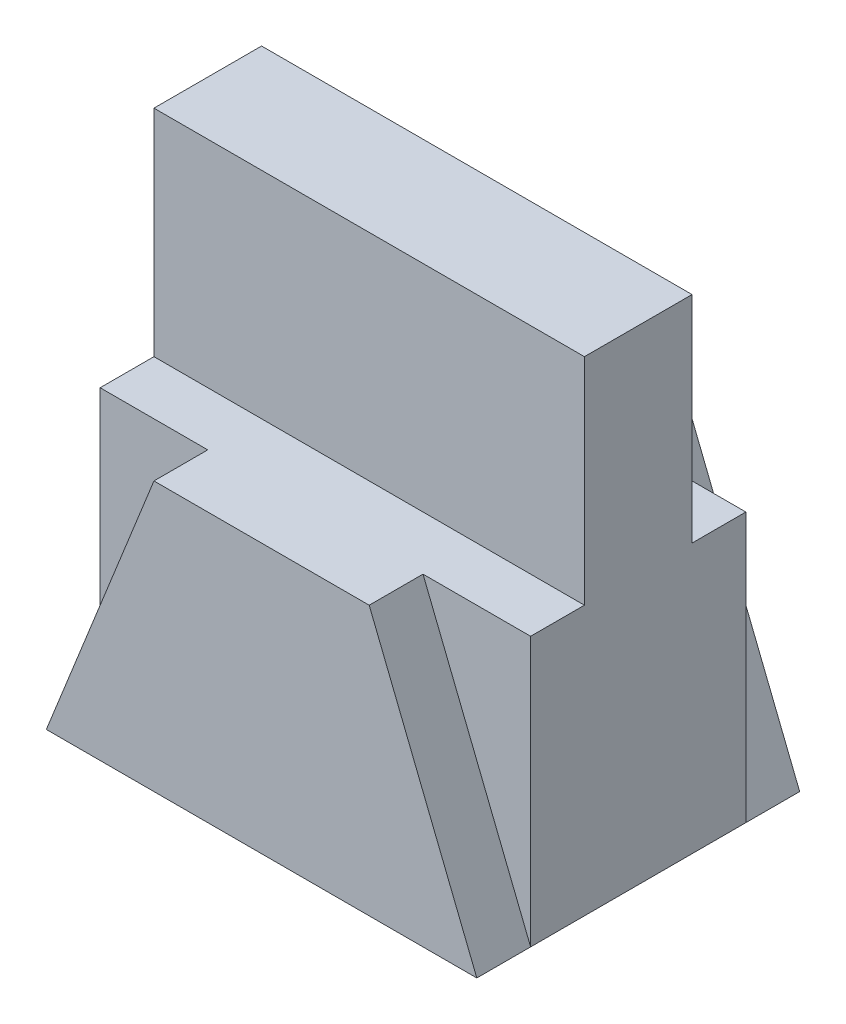
ISO-10303-21;
HEADER;
FILE_DESCRIPTION(('STEP AP214'),'2;1');
FILE_NAME('part.step','',(''),(''),'','','');
FILE_SCHEMA(('AUTOMOTIVE_DESIGN { 1 0 10303 214 1 1 1 1 }'));
ENDSEC;
DATA;
#1=APPLICATION_CONTEXT('core data for automotive mechanical design processes');
#2=APPLICATION_PROTOCOL_DEFINITION('international standard','automotive_design',2000,#1);
#3=PRODUCT_CONTEXT('',#1,'mechanical');
#4=PRODUCT('Part','Part','',(#3));
#5=PRODUCT_RELATED_PRODUCT_CATEGORY('part','',(#4));
#6=PRODUCT_DEFINITION_FORMATION('','',#4);
#7=PRODUCT_DEFINITION_CONTEXT('part definition',#1,'design');
#8=PRODUCT_DEFINITION('design','',#6,#7);
#9=PRODUCT_DEFINITION_SHAPE('','',#8);
#10=(LENGTH_UNIT() NAMED_UNIT(*) SI_UNIT(.MILLI.,.METRE.));
#11=(NAMED_UNIT(*) PLANE_ANGLE_UNIT() SI_UNIT($,.RADIAN.));
#12=(NAMED_UNIT(*) SI_UNIT($,.STERADIAN.) SOLID_ANGLE_UNIT());
#13=UNCERTAINTY_MEASURE_WITH_UNIT(LENGTH_MEASURE(1.E-05),#10,'distance_accuracy_value','');
#14=(GEOMETRIC_REPRESENTATION_CONTEXT(3) GLOBAL_UNCERTAINTY_ASSIGNED_CONTEXT((#13)) GLOBAL_UNIT_ASSIGNED_CONTEXT((#10,
#11,#12)) REPRESENTATION_CONTEXT('',''));
#15=CARTESIAN_POINT('',(0.,0.,0.));
#16=DIRECTION('',(0.,0.,1.));
#17=DIRECTION('',(1.,0.,0.));
#18=AXIS2_PLACEMENT_3D('',#15,#16,#17);
#19=CARTESIAN_POINT('',(20.,0.,-15.));
#20=DIRECTION('',(0.,0.,1.));
#21=DIRECTION('',(0.,-1.,0.));
#22=AXIS2_PLACEMENT_3D('',#19,#20,#21);
#23=PLANE('',#22);
#24=DIRECTION('',(0.371390676354103,-0.928476690885259,0.));
#25=VECTOR('',#24,1.);
#26=CARTESIAN_POINT('',(20.,0.,-15.));
#27=LINE('',#26,#25);
#28=CARTESIAN_POINT('',(10.,25.,-15.));
#29=VERTEX_POINT('',#28);
#30=CARTESIAN_POINT('',(20.,0.,-15.));
#31=VERTEX_POINT('',#30);
#32=EDGE_CURVE('E139',#29,#31,#27,.T.);
#33=ORIENTED_EDGE('',*,*,#32,.T.);
#34=DIRECTION('',(-1.,0.,0.));
#35=VECTOR('',#34,1.);
#36=CARTESIAN_POINT('',(20.,0.,-15.));
#37=LINE('',#36,#35);
#38=CARTESIAN_POINT('',(-20.,0.,-15.));
#39=VERTEX_POINT('',#38);
#40=EDGE_CURVE('E40',#31,#39,#37,.T.);
#41=ORIENTED_EDGE('',*,*,#40,.T.);
#42=DIRECTION('',(0.371390676354104,0.928476690885259,0.));
#43=VECTOR('',#42,1.);
#44=CARTESIAN_POINT('',(-10.,25.,-15.));
#45=LINE('',#44,#43);
#46=CARTESIAN_POINT('',(-10.,25.,-15.));
#47=VERTEX_POINT('',#46);
#48=EDGE_CURVE('E155',#39,#47,#45,.T.);
#49=ORIENTED_EDGE('',*,*,#48,.T.);
#50=DIRECTION('',(-1.,0.,0.));
#51=VECTOR('',#50,1.);
#52=CARTESIAN_POINT('',(20.,25.,-15.));
#53=LINE('',#52,#51);
#54=EDGE_CURVE('E239',#29,#47,#53,.T.);
#55=ORIENTED_EDGE('',*,*,#54,.F.);
#56=EDGE_LOOP('',(#33,#41,#49,#55));
#57=FACE_BOUND('',#56,.T.);
#58=ADVANCED_FACE('F32',(#57),#23,.F.);
#59=CARTESIAN_POINT('',(20.,25.,-15.));
#60=DIRECTION('',(0.,-1.,0.));
#61=DIRECTION('',(0.,0.,-1.));
#62=AXIS2_PLACEMENT_3D('',#59,#60,#61);
#63=PLANE('',#62);
#64=DIRECTION('',(0.,0.,-1.));
#65=VECTOR('',#64,1.);
#66=CARTESIAN_POINT('',(10.,25.,-10.));
#67=LINE('',#66,#65);
#68=CARTESIAN_POINT('',(10.,25.,-10.));
#69=VERTEX_POINT('',#68);
#70=EDGE_CURVE('E134',#69,#29,#67,.T.);
#71=ORIENTED_EDGE('',*,*,#70,.T.);
#72=ORIENTED_EDGE('',*,*,#54,.T.);
#73=DIRECTION('',(0.,0.,-1.));
#74=VECTOR('',#73,1.);
#75=CARTESIAN_POINT('',(-10.,25.,-10.));
#76=LINE('',#75,#74);
#77=CARTESIAN_POINT('',(-10.,25.,-10.));
#78=VERTEX_POINT('',#77);
#79=EDGE_CURVE('E165',#78,#47,#76,.T.);
#80=ORIENTED_EDGE('',*,*,#79,.F.);
#81=DIRECTION('',(-1.,0.,0.));
#82=VECTOR('',#81,1.);
#83=CARTESIAN_POINT('',(-20.,25.,-10.));
#84=LINE('',#83,#82);
#85=CARTESIAN_POINT('',(-20.,25.,-10.));
#86=VERTEX_POINT('',#85);
#87=EDGE_CURVE('E160',#78,#86,#84,.T.);
#88=ORIENTED_EDGE('',*,*,#87,.T.);
#89=DIRECTION('',(0.,0.,1.));
#90=VECTOR('',#89,1.);
#91=CARTESIAN_POINT('',(-20.,25.,-15.));
#92=LINE('',#91,#90);
#93=CARTESIAN_POINT('',(-20.,25.,-5.));
#94=VERTEX_POINT('',#93);
#95=EDGE_CURVE('E215',#86,#94,#92,.T.);
#96=ORIENTED_EDGE('',*,*,#95,.T.);
#97=DIRECTION('',(-1.,0.,0.));
#98=VECTOR('',#97,1.);
#99=CARTESIAN_POINT('',(20.,25.,-5.));
#100=LINE('',#99,#98);
#101=CARTESIAN_POINT('',(20.,25.,-5.));
#102=VERTEX_POINT('',#101);
#103=EDGE_CURVE('E236',#102,#94,#100,.T.);
#104=ORIENTED_EDGE('',*,*,#103,.F.);
#105=DIRECTION('',(0.,0.,1.));
#106=VECTOR('',#105,1.);
#107=CARTESIAN_POINT('',(20.,25.,-15.));
#108=LINE('',#107,#106);
#109=CARTESIAN_POINT('',(20.,25.,-9.99999999999999));
#110=VERTEX_POINT('',#109);
#111=EDGE_CURVE('E150',#110,#102,#108,.T.);
#112=ORIENTED_EDGE('',*,*,#111,.F.);
#113=DIRECTION('',(-1.,0.,0.));
#114=VECTOR('',#113,1.);
#115=CARTESIAN_POINT('',(10.,25.,-10.));
#116=LINE('',#115,#114);
#117=EDGE_CURVE('E47',#110,#69,#116,.T.);
#118=ORIENTED_EDGE('',*,*,#117,.T.);
#119=EDGE_LOOP('',(#71,#72,#80,#88,#96,#104,#112,#118));
#120=FACE_BOUND('',#119,.T.);
#121=ADVANCED_FACE('F148',(#120),#63,.F.);
#122=CARTESIAN_POINT('',(20.,25.,15.));
#123=DIRECTION('',(0.,0.,-1.));
#124=DIRECTION('',(0.,1.,0.));
#125=AXIS2_PLACEMENT_3D('',#122,#123,#124);
#126=PLANE('',#125);
#127=DIRECTION('',(-1.,0.,0.));
#128=VECTOR('',#127,1.);
#129=CARTESIAN_POINT('',(20.,0.,15.));
#130=LINE('',#129,#128);
#131=CARTESIAN_POINT('',(20.,0.,15.));
#132=VERTEX_POINT('',#131);
#133=CARTESIAN_POINT('',(-20.,0.,15.));
#134=VERTEX_POINT('',#133);
#135=EDGE_CURVE('E11',#132,#134,#130,.T.);
#136=ORIENTED_EDGE('',*,*,#135,.F.);
#137=DIRECTION('',(0.371390676354103,-0.928476690885259,0.));
#138=VECTOR('',#137,1.);
#139=CARTESIAN_POINT('',(20.,0.,15.));
#140=LINE('',#139,#138);
#141=CARTESIAN_POINT('',(10.,25.,15.));
#142=VERTEX_POINT('',#141);
#143=EDGE_CURVE('E169',#142,#132,#140,.T.);
#144=ORIENTED_EDGE('',*,*,#143,.F.);
#145=DIRECTION('',(-1.,0.,0.));
#146=VECTOR('',#145,1.);
#147=CARTESIAN_POINT('',(20.,25.,15.));
#148=LINE('',#147,#146);
#149=CARTESIAN_POINT('',(-10.,25.,15.));
#150=VERTEX_POINT('',#149);
#151=EDGE_CURVE('E211',#142,#150,#148,.T.);
#152=ORIENTED_EDGE('',*,*,#151,.T.);
#153=DIRECTION('',(0.371390676354104,0.928476690885259,0.));
#154=VECTOR('',#153,1.);
#155=CARTESIAN_POINT('',(-10.,25.,15.));
#156=LINE('',#155,#154);
#157=EDGE_CURVE('E182',#134,#150,#156,.T.);
#158=ORIENTED_EDGE('',*,*,#157,.F.);
#159=EDGE_LOOP('',(#136,#144,#152,#158));
#160=FACE_BOUND('',#159,.T.);
#161=ADVANCED_FACE('F34',(#160),#126,.F.);
#162=CARTESIAN_POINT('',(20.,0.,15.));
#163=DIRECTION('',(0.,1.,0.));
#164=DIRECTION('',(0.,0.,1.));
#165=AXIS2_PLACEMENT_3D('',#162,#163,#164);
#166=PLANE('',#165);
#167=DIRECTION('',(0.,0.,-1.));
#168=VECTOR('',#167,1.);
#169=CARTESIAN_POINT('',(-20.,0.,15.));
#170=LINE('',#169,#168);
#171=CARTESIAN_POINT('',(-20.,0.,10.));
#172=VERTEX_POINT('',#171);
#173=EDGE_CURVE('E212',#134,#172,#170,.T.);
#174=ORIENTED_EDGE('',*,*,#173,.T.);
#175=CARTESIAN_POINT('',(-20.,0.,-10.));
#176=VERTEX_POINT('',#175);
#177=EDGE_CURVE('E196',#172,#176,#170,.T.);
#178=ORIENTED_EDGE('',*,*,#177,.T.);
#179=DIRECTION('',(0.,0.,-1.));
#180=VECTOR('',#179,1.);
#181=CARTESIAN_POINT('',(-20.,0.,-10.));
#182=LINE('',#181,#180);
#183=EDGE_CURVE('E55',#176,#39,#182,.T.);
#184=ORIENTED_EDGE('',*,*,#183,.T.);
#185=ORIENTED_EDGE('',*,*,#40,.F.);
#186=DIRECTION('',(0.,0.,-1.));
#187=VECTOR('',#186,1.);
#188=CARTESIAN_POINT('',(20.,0.,-10.));
#189=LINE('',#188,#187);
#190=CARTESIAN_POINT('',(20.,0.,-10.));
#191=VERTEX_POINT('',#190);
#192=EDGE_CURVE('E142',#191,#31,#189,.T.);
#193=ORIENTED_EDGE('',*,*,#192,.F.);
#194=DIRECTION('',(0.,0.,-1.));
#195=VECTOR('',#194,1.);
#196=CARTESIAN_POINT('',(20.,0.,15.));
#197=LINE('',#196,#195);
#198=CARTESIAN_POINT('',(20.,0.,9.99999999999999));
#199=VERTEX_POINT('',#198);
#200=EDGE_CURVE('E200',#199,#191,#197,.T.);
#201=ORIENTED_EDGE('',*,*,#200,.F.);
#202=EDGE_CURVE('E197',#132,#199,#197,.T.);
#203=ORIENTED_EDGE('',*,*,#202,.F.);
#204=ORIENTED_EDGE('',*,*,#135,.T.);
#205=EDGE_LOOP('',(#174,#178,#184,#185,#193,#201,#203,#204));
#206=FACE_BOUND('',#205,.T.);
#207=ADVANCED_FACE('F244',(#206),#166,.F.);
#208=CARTESIAN_POINT('',(20.,25.,-5.));
#209=DIRECTION('',(0.,0.,1.));
#210=DIRECTION('',(0.,-1.,0.));
#211=AXIS2_PLACEMENT_3D('',#208,#209,#210);
#212=PLANE('',#211);
#213=DIRECTION('',(0.,1.,0.));
#214=VECTOR('',#213,1.);
#215=CARTESIAN_POINT('',(-20.,25.,-5.));
#216=LINE('',#215,#214);
#217=CARTESIAN_POINT('',(-20.,45.,-5.));
#218=VERTEX_POINT('',#217);
#219=EDGE_CURVE('E217',#94,#218,#216,.T.);
#220=ORIENTED_EDGE('',*,*,#219,.T.);
#221=DIRECTION('',(-1.,0.,0.));
#222=VECTOR('',#221,1.);
#223=CARTESIAN_POINT('',(20.,45.,-5.));
#224=LINE('',#223,#222);
#225=CARTESIAN_POINT('',(20.,45.,-5.));
#226=VERTEX_POINT('',#225);
#227=EDGE_CURVE('E233',#226,#218,#224,.T.);
#228=ORIENTED_EDGE('',*,*,#227,.F.);
#229=DIRECTION('',(0.,1.,0.));
#230=VECTOR('',#229,1.);
#231=CARTESIAN_POINT('',(20.,25.,-5.));
#232=LINE('',#231,#230);
#233=EDGE_CURVE('E202',#102,#226,#232,.T.);
#234=ORIENTED_EDGE('',*,*,#233,.F.);
#235=ORIENTED_EDGE('',*,*,#103,.T.);
#236=EDGE_LOOP('',(#220,#228,#234,#235));
#237=FACE_BOUND('',#236,.T.);
#238=ADVANCED_FACE('F279',(#237),#212,.F.);
#239=CARTESIAN_POINT('',(20.,45.,-5.));
#240=DIRECTION('',(0.,-1.,0.));
#241=DIRECTION('',(0.,0.,-1.));
#242=AXIS2_PLACEMENT_3D('',#239,#240,#241);
#243=PLANE('',#242);
#244=DIRECTION('',(0.,0.,1.));
#245=VECTOR('',#244,1.);
#246=CARTESIAN_POINT('',(-20.,45.,-5.));
#247=LINE('',#246,#245);
#248=CARTESIAN_POINT('',(-20.,45.,5.));
#249=VERTEX_POINT('',#248);
#250=EDGE_CURVE('E219',#218,#249,#247,.T.);
#251=ORIENTED_EDGE('',*,*,#250,.T.);
#252=DIRECTION('',(-1.,0.,0.));
#253=VECTOR('',#252,1.);
#254=CARTESIAN_POINT('',(20.,45.,5.));
#255=LINE('',#254,#253);
#256=CARTESIAN_POINT('',(20.,45.,5.));
#257=VERTEX_POINT('',#256);
#258=EDGE_CURVE('E230',#257,#249,#255,.T.);
#259=ORIENTED_EDGE('',*,*,#258,.F.);
#260=DIRECTION('',(0.,0.,1.));
#261=VECTOR('',#260,1.);
#262=CARTESIAN_POINT('',(20.,45.,-5.));
#263=LINE('',#262,#261);
#264=EDGE_CURVE('E204',#226,#257,#263,.T.);
#265=ORIENTED_EDGE('',*,*,#264,.F.);
#266=ORIENTED_EDGE('',*,*,#227,.T.);
#267=EDGE_LOOP('',(#251,#259,#265,#266));
#268=FACE_BOUND('',#267,.T.);
#269=ADVANCED_FACE('F284',(#268),#243,.F.);
#270=CARTESIAN_POINT('',(20.,45.,5.));
#271=DIRECTION('',(0.,0.,-1.));
#272=DIRECTION('',(0.,1.,0.));
#273=AXIS2_PLACEMENT_3D('',#270,#271,#272);
#274=PLANE('',#273);
#275=DIRECTION('',(0.,-1.,0.));
#276=VECTOR('',#275,1.);
#277=CARTESIAN_POINT('',(-20.,45.,5.));
#278=LINE('',#277,#276);
#279=CARTESIAN_POINT('',(-20.,25.,5.));
#280=VERTEX_POINT('',#279);
#281=EDGE_CURVE('E221',#249,#280,#278,.T.);
#282=ORIENTED_EDGE('',*,*,#281,.T.);
#283=DIRECTION('',(-1.,0.,0.));
#284=VECTOR('',#283,1.);
#285=CARTESIAN_POINT('',(20.,25.,5.));
#286=LINE('',#285,#284);
#287=CARTESIAN_POINT('',(20.,25.,5.));
#288=VERTEX_POINT('',#287);
#289=EDGE_CURVE('E227',#288,#280,#286,.T.);
#290=ORIENTED_EDGE('',*,*,#289,.F.);
#291=DIRECTION('',(0.,-1.,0.));
#292=VECTOR('',#291,1.);
#293=CARTESIAN_POINT('',(20.,45.,5.));
#294=LINE('',#293,#292);
#295=EDGE_CURVE('E206',#257,#288,#294,.T.);
#296=ORIENTED_EDGE('',*,*,#295,.F.);
#297=ORIENTED_EDGE('',*,*,#258,.T.);
#298=EDGE_LOOP('',(#282,#290,#296,#297));
#299=FACE_BOUND('',#298,.T.);
#300=ADVANCED_FACE('F312',(#299),#274,.F.);
#301=CARTESIAN_POINT('',(20.,25.,5.));
#302=DIRECTION('',(0.,-1.,0.));
#303=DIRECTION('',(0.,0.,-1.));
#304=AXIS2_PLACEMENT_3D('',#301,#302,#303);
#305=PLANE('',#304);
#306=ORIENTED_EDGE('',*,*,#151,.F.);
#307=DIRECTION('',(0.,0.,1.));
#308=VECTOR('',#307,1.);
#309=CARTESIAN_POINT('',(10.,25.,10.));
#310=LINE('',#309,#308);
#311=CARTESIAN_POINT('',(10.,25.,10.));
#312=VERTEX_POINT('',#311);
#313=EDGE_CURVE('E179',#312,#142,#310,.T.);
#314=ORIENTED_EDGE('',*,*,#313,.F.);
#315=DIRECTION('',(-1.,0.,0.));
#316=VECTOR('',#315,1.);
#317=CARTESIAN_POINT('',(10.,25.,10.));
#318=LINE('',#317,#316);
#319=CARTESIAN_POINT('',(20.,25.,10.));
#320=VERTEX_POINT('',#319);
#321=EDGE_CURVE('E176',#320,#312,#318,.T.);
#322=ORIENTED_EDGE('',*,*,#321,.F.);
#323=DIRECTION('',(0.,0.,1.));
#324=VECTOR('',#323,1.);
#325=CARTESIAN_POINT('',(20.,25.,5.));
#326=LINE('',#325,#324);
#327=EDGE_CURVE('E208',#288,#320,#326,.T.);
#328=ORIENTED_EDGE('',*,*,#327,.F.);
#329=ORIENTED_EDGE('',*,*,#289,.T.);
#330=DIRECTION('',(0.,0.,1.));
#331=VECTOR('',#330,1.);
#332=CARTESIAN_POINT('',(-20.,25.,5.));
#333=LINE('',#332,#331);
#334=CARTESIAN_POINT('',(-20.,25.,10.));
#335=VERTEX_POINT('',#334);
#336=EDGE_CURVE('E223',#280,#335,#333,.T.);
#337=ORIENTED_EDGE('',*,*,#336,.T.);
#338=DIRECTION('',(-1.,0.,0.));
#339=VECTOR('',#338,1.);
#340=CARTESIAN_POINT('',(-20.,25.,10.));
#341=LINE('',#340,#339);
#342=CARTESIAN_POINT('',(-10.,25.,10.));
#343=VERTEX_POINT('',#342);
#344=EDGE_CURVE('E189',#343,#335,#341,.T.);
#345=ORIENTED_EDGE('',*,*,#344,.F.);
#346=DIRECTION('',(0.,0.,1.));
#347=VECTOR('',#346,1.);
#348=CARTESIAN_POINT('',(-10.,25.,10.));
#349=LINE('',#348,#347);
#350=EDGE_CURVE('E191',#343,#150,#349,.T.);
#351=ORIENTED_EDGE('',*,*,#350,.T.);
#352=EDGE_LOOP('',(#306,#314,#322,#328,#329,#337,#345,#351));
#353=FACE_BOUND('',#352,.T.);
#354=ADVANCED_FACE('F302',(#353),#305,.F.);
#355=CARTESIAN_POINT('',(20.,0.,0.));
#356=DIRECTION('',(1.,0.,0.));
#357=DIRECTION('',(0.,0.,-1.));
#358=AXIS2_PLACEMENT_3D('',#355,#356,#357);
#359=PLANE('',#358);
#360=DIRECTION('',(0.,1.,0.));
#361=VECTOR('',#360,1.);
#362=CARTESIAN_POINT('',(20.,25.,-10.));
#363=LINE('',#362,#361);
#364=EDGE_CURVE('E143',#191,#110,#363,.T.);
#365=ORIENTED_EDGE('',*,*,#364,.T.);
#366=ORIENTED_EDGE('',*,*,#111,.T.);
#367=ORIENTED_EDGE('',*,*,#233,.T.);
#368=ORIENTED_EDGE('',*,*,#264,.T.);
#369=ORIENTED_EDGE('',*,*,#295,.T.);
#370=ORIENTED_EDGE('',*,*,#327,.T.);
#371=DIRECTION('',(0.,1.,0.));
#372=VECTOR('',#371,1.);
#373=CARTESIAN_POINT('',(20.,25.,10.));
#374=LINE('',#373,#372);
#375=EDGE_CURVE('E174',#199,#320,#374,.T.);
#376=ORIENTED_EDGE('',*,*,#375,.F.);
#377=ORIENTED_EDGE('',*,*,#200,.T.);
#378=EDGE_LOOP('',(#365,#366,#367,#368,#369,#370,#376,#377));
#379=FACE_BOUND('',#378,.T.);
#380=ADVANCED_FACE('F297',(#379),#359,.T.);
#381=CARTESIAN_POINT('',(-20.,0.,0.));
#382=DIRECTION('',(1.,0.,0.));
#383=DIRECTION('',(0.,0.,-1.));
#384=AXIS2_PLACEMENT_3D('',#381,#382,#383);
#385=PLANE('',#384);
#386=ORIENTED_EDGE('',*,*,#95,.F.);
#387=DIRECTION('',(0.,-1.,0.));
#388=VECTOR('',#387,1.);
#389=CARTESIAN_POINT('',(-20.,0.,-10.));
#390=LINE('',#389,#388);
#391=EDGE_CURVE('E157',#86,#176,#390,.T.);
#392=ORIENTED_EDGE('',*,*,#391,.T.);
#393=ORIENTED_EDGE('',*,*,#177,.F.);
#394=DIRECTION('',(0.,-1.,0.));
#395=VECTOR('',#394,1.);
#396=CARTESIAN_POINT('',(-20.,0.,10.));
#397=LINE('',#396,#395);
#398=EDGE_CURVE('E183',#335,#172,#397,.T.);
#399=ORIENTED_EDGE('',*,*,#398,.F.);
#400=ORIENTED_EDGE('',*,*,#336,.F.);
#401=ORIENTED_EDGE('',*,*,#281,.F.);
#402=ORIENTED_EDGE('',*,*,#250,.F.);
#403=ORIENTED_EDGE('',*,*,#219,.F.);
#404=EDGE_LOOP('',(#386,#392,#393,#399,#400,#401,#402,#403));
#405=FACE_BOUND('',#404,.T.);
#406=ADVANCED_FACE('F252',(#405),#385,.F.);
#407=CARTESIAN_POINT('',(-10.,25.,10.));
#408=DIRECTION('',(0.928476690885259,-0.371390676354104,0.));
#409=DIRECTION('',(0.371390676354104,0.928476690885259,0.));
#410=AXIS2_PLACEMENT_3D('',#407,#408,#409);
#411=PLANE('',#410);
#412=ORIENTED_EDGE('',*,*,#157,.T.);
#413=ORIENTED_EDGE('',*,*,#350,.F.);
#414=DIRECTION('',(0.371390676354104,0.928476690885259,0.));
#415=VECTOR('',#414,1.);
#416=CARTESIAN_POINT('',(-10.,25.,10.));
#417=LINE('',#416,#415);
#418=EDGE_CURVE('E186',#172,#343,#417,.T.);
#419=ORIENTED_EDGE('',*,*,#418,.F.);
#420=ORIENTED_EDGE('',*,*,#173,.F.);
#421=EDGE_LOOP('',(#412,#413,#419,#420));
#422=FACE_BOUND('',#421,.T.);
#423=ADVANCED_FACE('F305',(#422),#411,.F.);
#424=CARTESIAN_POINT('',(0.,0.,10.));
#425=DIRECTION('',(0.,0.,-1.));
#426=DIRECTION('',(-1.,0.,0.));
#427=AXIS2_PLACEMENT_3D('',#424,#425,#426);
#428=PLANE('',#427);
#429=ORIENTED_EDGE('',*,*,#398,.T.);
#430=ORIENTED_EDGE('',*,*,#418,.T.);
#431=ORIENTED_EDGE('',*,*,#344,.T.);
#432=EDGE_LOOP('',(#429,#430,#431));
#433=FACE_BOUND('',#432,.T.);
#434=ADVANCED_FACE('F307',(#433),#428,.F.);
#435=CARTESIAN_POINT('',(20.,0.,10.));
#436=DIRECTION('',(-0.928476690885259,-0.371390676354103,0.));
#437=DIRECTION('',(0.371390676354103,-0.928476690885259,0.));
#438=AXIS2_PLACEMENT_3D('',#435,#436,#437);
#439=PLANE('',#438);
#440=ORIENTED_EDGE('',*,*,#143,.T.);
#441=ORIENTED_EDGE('',*,*,#202,.T.);
#442=DIRECTION('',(0.371390676354103,-0.928476690885259,0.));
#443=VECTOR('',#442,1.);
#444=CARTESIAN_POINT('',(20.,0.,10.));
#445=LINE('',#444,#443);
#446=EDGE_CURVE('E172',#312,#199,#445,.T.);
#447=ORIENTED_EDGE('',*,*,#446,.F.);
#448=ORIENTED_EDGE('',*,*,#313,.T.);
#449=EDGE_LOOP('',(#440,#441,#447,#448));
#450=FACE_BOUND('',#449,.T.);
#451=ADVANCED_FACE('F268',(#450),#439,.F.);
#452=CARTESIAN_POINT('',(0.,0.,9.99999999999999));
#453=DIRECTION('',(0.,0.,-1.));
#454=DIRECTION('',(-1.,0.,0.));
#455=AXIS2_PLACEMENT_3D('',#452,#453,#454);
#456=PLANE('',#455);
#457=ORIENTED_EDGE('',*,*,#446,.T.);
#458=ORIENTED_EDGE('',*,*,#375,.T.);
#459=ORIENTED_EDGE('',*,*,#321,.T.);
#460=EDGE_LOOP('',(#457,#458,#459));
#461=FACE_BOUND('',#460,.T.);
#462=ADVANCED_FACE('F261',(#461),#456,.F.);
#463=CARTESIAN_POINT('',(-10.,25.,-10.));
#464=DIRECTION('',(-0.928476690885259,0.371390676354104,0.));
#465=DIRECTION('',(-0.371390676354104,-0.928476690885259,0.));
#466=AXIS2_PLACEMENT_3D('',#463,#464,#465);
#467=PLANE('',#466);
#468=ORIENTED_EDGE('',*,*,#48,.F.);
#469=ORIENTED_EDGE('',*,*,#183,.F.);
#470=DIRECTION('',(0.371390676354104,0.928476690885259,0.));
#471=VECTOR('',#470,1.);
#472=CARTESIAN_POINT('',(-10.,25.,-10.));
#473=LINE('',#472,#471);
#474=EDGE_CURVE('E163',#176,#78,#473,.T.);
#475=ORIENTED_EDGE('',*,*,#474,.T.);
#476=ORIENTED_EDGE('',*,*,#79,.T.);
#477=EDGE_LOOP('',(#468,#469,#475,#476));
#478=FACE_BOUND('',#477,.T.);
#479=ADVANCED_FACE('F259',(#478),#467,.T.);
#480=CARTESIAN_POINT('',(0.,0.,-10.));
#481=DIRECTION('',(0.,0.,1.));
#482=DIRECTION('',(-1.,0.,0.));
#483=AXIS2_PLACEMENT_3D('',#480,#481,#482);
#484=PLANE('',#483);
#485=ORIENTED_EDGE('',*,*,#391,.F.);
#486=ORIENTED_EDGE('',*,*,#87,.F.);
#487=ORIENTED_EDGE('',*,*,#474,.F.);
#488=EDGE_LOOP('',(#485,#486,#487));
#489=FACE_BOUND('',#488,.T.);
#490=ADVANCED_FACE('F257',(#489),#484,.F.);
#491=CARTESIAN_POINT('',(20.,0.,-10.));
#492=DIRECTION('',(0.928476690885259,0.371390676354103,0.));
#493=DIRECTION('',(-0.371390676354103,0.928476690885259,0.));
#494=AXIS2_PLACEMENT_3D('',#491,#492,#493);
#495=PLANE('',#494);
#496=ORIENTED_EDGE('',*,*,#32,.F.);
#497=ORIENTED_EDGE('',*,*,#70,.F.);
#498=DIRECTION('',(0.371390676354103,-0.928476690885259,0.));
#499=VECTOR('',#498,1.);
#500=CARTESIAN_POINT('',(20.,0.,-10.));
#501=LINE('',#500,#499);
#502=EDGE_CURVE('E136',#69,#191,#501,.T.);
#503=ORIENTED_EDGE('',*,*,#502,.T.);
#504=ORIENTED_EDGE('',*,*,#192,.T.);
#505=EDGE_LOOP('',(#496,#497,#503,#504));
#506=FACE_BOUND('',#505,.T.);
#507=ADVANCED_FACE('F135',(#506),#495,.T.);
#508=CARTESIAN_POINT('',(0.,0.,-9.99999999999999));
#509=DIRECTION('',(0.,0.,1.));
#510=DIRECTION('',(-1.,0.,0.));
#511=AXIS2_PLACEMENT_3D('',#508,#509,#510);
#512=PLANE('',#511);
#513=ORIENTED_EDGE('',*,*,#502,.F.);
#514=ORIENTED_EDGE('',*,*,#117,.F.);
#515=ORIENTED_EDGE('',*,*,#364,.F.);
#516=EDGE_LOOP('',(#513,#514,#515));
#517=FACE_BOUND('',#516,.T.);
#518=ADVANCED_FACE('F145',(#517),#512,.F.);
#519=CLOSED_SHELL('',(#58,#121,#161,#207,#238,#269,#300,#354,#380,#406,#423,#434,#451,#462,#479,
#490,#507,#518));
#520=MANIFOLD_SOLID_BREP('B2',#519);
#521=ADVANCED_BREP_SHAPE_REPRESENTATION('',(#18,#520),#14);
#522=SHAPE_DEFINITION_REPRESENTATION(#9,#521);
ENDSEC;
END-ISO-10303-21;
